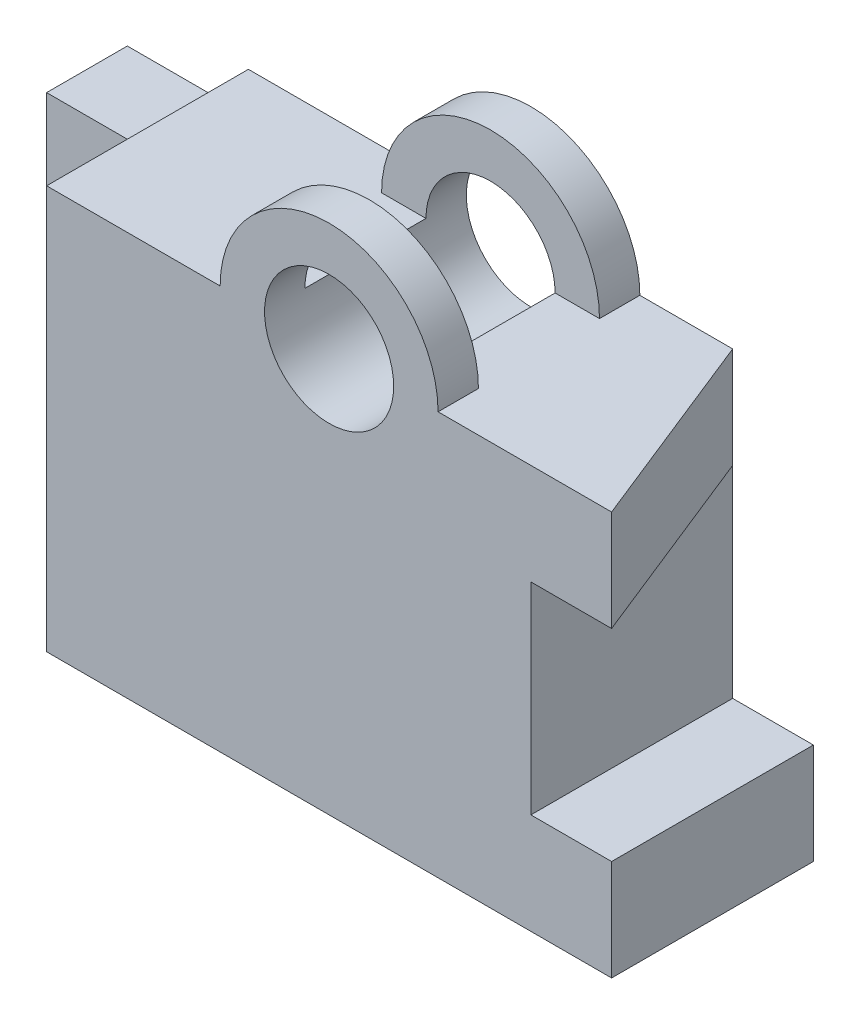
ISO-10303-21;
HEADER;
FILE_DESCRIPTION(('STEP AP214'),'2;1');
FILE_NAME('part.step','',(''),(''),'','','');
FILE_SCHEMA(('AUTOMOTIVE_DESIGN { 1 0 10303 214 1 1 1 1 }'));
ENDSEC;
DATA;
#1=APPLICATION_CONTEXT('core data for automotive mechanical design processes');
#2=APPLICATION_PROTOCOL_DEFINITION('international standard','automotive_design',2000,#1);
#3=PRODUCT_CONTEXT('',#1,'mechanical');
#4=PRODUCT('Part','Part','',(#3));
#5=PRODUCT_RELATED_PRODUCT_CATEGORY('part','',(#4));
#6=PRODUCT_DEFINITION_FORMATION('','',#4);
#7=PRODUCT_DEFINITION_CONTEXT('part definition',#1,'design');
#8=PRODUCT_DEFINITION('design','',#6,#7);
#9=PRODUCT_DEFINITION_SHAPE('','',#8);
#10=(LENGTH_UNIT() NAMED_UNIT(*) SI_UNIT(.MILLI.,.METRE.));
#11=(NAMED_UNIT(*) PLANE_ANGLE_UNIT() SI_UNIT($,.RADIAN.));
#12=(NAMED_UNIT(*) SI_UNIT($,.STERADIAN.) SOLID_ANGLE_UNIT());
#13=UNCERTAINTY_MEASURE_WITH_UNIT(LENGTH_MEASURE(1.E-05),#10,'distance_accuracy_value','');
#14=(GEOMETRIC_REPRESENTATION_CONTEXT(3) GLOBAL_UNCERTAINTY_ASSIGNED_CONTEXT((#13)) GLOBAL_UNIT_ASSIGNED_CONTEXT((#10,
#11,#12)) REPRESENTATION_CONTEXT('',''));
#15=CARTESIAN_POINT('',(0.,0.,0.));
#16=DIRECTION('',(0.,0.,1.));
#17=DIRECTION('',(1.,0.,0.));
#18=AXIS2_PLACEMENT_3D('',#15,#16,#17);
#19=CARTESIAN_POINT('',(0.,25.,25.));
#20=DIRECTION('',(0.,1.,0.));
#21=DIRECTION('',(0.,0.,1.));
#22=AXIS2_PLACEMENT_3D('',#19,#20,#21);
#23=PLANE('',#22);
#24=DIRECTION('',(0.,0.,-1.));
#25=VECTOR('',#24,1.);
#26=CARTESIAN_POINT('',(-8.,25.,25.));
#27=LINE('',#26,#25);
#28=CARTESIAN_POINT('',(-8.,25.,20.));
#29=VERTEX_POINT('',#28);
#30=CARTESIAN_POINT('',(-8.,25.,5.));
#31=VERTEX_POINT('',#30);
#32=EDGE_CURVE('E224',#29,#31,#27,.T.);
#33=ORIENTED_EDGE('',*,*,#32,.T.);
#34=DIRECTION('',(-1.,0.,0.));
#35=VECTOR('',#34,1.);
#36=CARTESIAN_POINT('',(0.,25.,5.));
#37=LINE('',#36,#35);
#38=CARTESIAN_POINT('',(-13.5,25.,5.));
#39=VERTEX_POINT('',#38);
#40=EDGE_CURVE('E51',#31,#39,#37,.T.);
#41=ORIENTED_EDGE('',*,*,#40,.T.);
#42=DIRECTION('',(0.,0.,-1.));
#43=VECTOR('',#42,1.);
#44=CARTESIAN_POINT('',(-13.5,25.,5.));
#45=LINE('',#44,#43);
#46=CARTESIAN_POINT('',(-13.5,25.,0.));
#47=VERTEX_POINT('',#46);
#48=EDGE_CURVE('E55',#39,#47,#45,.T.);
#49=ORIENTED_EDGE('',*,*,#48,.T.);
#50=DIRECTION('',(1.,0.,0.));
#51=VECTOR('',#50,1.);
#52=CARTESIAN_POINT('',(0.,25.,0.));
#53=LINE('',#52,#51);
#54=CARTESIAN_POINT('',(-35.,25.,0.));
#55=VERTEX_POINT('',#54);
#56=EDGE_CURVE('E255',#55,#47,#53,.T.);
#57=ORIENTED_EDGE('',*,*,#56,.F.);
#58=DIRECTION('',(0.,0.,-1.));
#59=VECTOR('',#58,1.);
#60=CARTESIAN_POINT('',(-35.,25.,25.));
#61=LINE('',#60,#59);
#62=CARTESIAN_POINT('',(-35.,25.,25.));
#63=VERTEX_POINT('',#62);
#64=EDGE_CURVE('E221',#63,#55,#61,.T.);
#65=ORIENTED_EDGE('',*,*,#64,.F.);
#66=DIRECTION('',(1.,0.,0.));
#67=VECTOR('',#66,1.);
#68=CARTESIAN_POINT('',(0.,25.,25.));
#69=LINE('',#68,#67);
#70=CARTESIAN_POINT('',(-13.5,25.,25.));
#71=VERTEX_POINT('',#70);
#72=EDGE_CURVE('E208',#63,#71,#69,.T.);
#73=ORIENTED_EDGE('',*,*,#72,.T.);
#74=DIRECTION('',(0.,0.,1.));
#75=VECTOR('',#74,1.);
#76=CARTESIAN_POINT('',(-13.5,25.,20.));
#77=LINE('',#76,#75);
#78=CARTESIAN_POINT('',(-13.5,25.,20.));
#79=VERTEX_POINT('',#78);
#80=EDGE_CURVE('E297',#79,#71,#77,.T.);
#81=ORIENTED_EDGE('',*,*,#80,.F.);
#82=DIRECTION('',(1.,0.,0.));
#83=VECTOR('',#82,1.);
#84=CARTESIAN_POINT('',(0.,25.,20.));
#85=LINE('',#84,#83);
#86=EDGE_CURVE('E256',#79,#29,#85,.T.);
#87=ORIENTED_EDGE('',*,*,#86,.T.);
#88=EDGE_LOOP('',(#33,#41,#49,#57,#65,#73,#81,#87));
#89=FACE_BOUND('',#88,.T.);
#90=ADVANCED_FACE('F36',(#89),#23,.T.);
#91=DIRECTION('',(0.,0.,-1.));
#92=VECTOR('',#91,1.);
#93=CARTESIAN_POINT('',(13.5,25.,5.));
#94=LINE('',#93,#92);
#95=CARTESIAN_POINT('',(13.5,25.,0.));
#96=VERTEX_POINT('',#95);
#97=CARTESIAN_POINT('',(13.5,25.,5.));
#98=VERTEX_POINT('',#97);
#99=EDGE_CURVE('E44',#96,#98,#94,.F.);
#100=ORIENTED_EDGE('',*,*,#99,.T.);
#101=DIRECTION('',(-1.,0.,0.));
#102=VECTOR('',#101,1.);
#103=CARTESIAN_POINT('',(0.,25.,5.));
#104=LINE('',#103,#102);
#105=CARTESIAN_POINT('',(8.,25.,5.));
#106=VERTEX_POINT('',#105);
#107=EDGE_CURVE('E11',#98,#106,#104,.T.);
#108=ORIENTED_EDGE('',*,*,#107,.T.);
#109=DIRECTION('',(0.,0.,-1.));
#110=VECTOR('',#109,1.);
#111=CARTESIAN_POINT('',(8.,25.,25.));
#112=LINE('',#111,#110);
#113=CARTESIAN_POINT('',(8.,25.,20.));
#114=VERTEX_POINT('',#113);
#115=EDGE_CURVE('E193',#114,#106,#112,.T.);
#116=ORIENTED_EDGE('',*,*,#115,.F.);
#117=DIRECTION('',(1.,0.,0.));
#118=VECTOR('',#117,1.);
#119=CARTESIAN_POINT('',(0.,25.,20.));
#120=LINE('',#119,#118);
#121=CARTESIAN_POINT('',(13.5,25.,20.));
#122=VERTEX_POINT('',#121);
#123=EDGE_CURVE('E226',#114,#122,#120,.T.);
#124=ORIENTED_EDGE('',*,*,#123,.T.);
#125=DIRECTION('',(0.,0.,1.));
#126=VECTOR('',#125,1.);
#127=CARTESIAN_POINT('',(13.5,25.,20.));
#128=LINE('',#127,#126);
#129=CARTESIAN_POINT('',(13.5,25.,25.));
#130=VERTEX_POINT('',#129);
#131=EDGE_CURVE('E293',#130,#122,#128,.F.);
#132=ORIENTED_EDGE('',*,*,#131,.F.);
#133=CARTESIAN_POINT('',(35.,25.,25.));
#134=VERTEX_POINT('',#133);
#135=EDGE_CURVE('E200',#130,#134,#69,.T.);
#136=ORIENTED_EDGE('',*,*,#135,.T.);
#137=DIRECTION('',(0.371390676354104,0.,0.928476690885259));
#138=VECTOR('',#137,1.);
#139=CARTESIAN_POINT('',(30.1724137931035,25.,12.9310344827586));
#140=LINE('',#139,#138);
#141=CARTESIAN_POINT('',(25.,25.,0.));
#142=VERTEX_POINT('',#141);
#143=EDGE_CURVE('E286',#142,#134,#140,.T.);
#144=ORIENTED_EDGE('',*,*,#143,.F.);
#145=EDGE_CURVE('E258',#96,#142,#53,.T.);
#146=ORIENTED_EDGE('',*,*,#145,.F.);
#147=EDGE_LOOP('',(#100,#108,#116,#124,#132,#136,#144,#146));
#148=FACE_BOUND('',#147,.T.);
#149=ADVANCED_FACE('F191',(#148),#23,.T.);
#150=CARTESIAN_POINT('',(-20.,7.,-10.));
#151=DIRECTION('',(-1.,0.,0.));
#152=DIRECTION('',(0.,0.,1.));
#153=AXIS2_PLACEMENT_3D('',#150,#151,#152);
#154=PLANE('',#153);
#155=DIRECTION('',(0.,0.,-1.));
#156=VECTOR('',#155,1.);
#157=CARTESIAN_POINT('',(-20.,4.,0.));
#158=LINE('',#157,#156);
#159=CARTESIAN_POINT('',(-20.,4.,0.));
#160=VERTEX_POINT('',#159);
#161=CARTESIAN_POINT('',(-20.,4.,-10.));
#162=VERTEX_POINT('',#161);
#163=EDGE_CURVE('E362',#160,#162,#158,.T.);
#164=ORIENTED_EDGE('',*,*,#163,.F.);
#165=DIRECTION('',(0.,-1.,0.));
#166=VECTOR('',#165,1.);
#167=CARTESIAN_POINT('',(-20.,7.,0.));
#168=LINE('',#167,#166);
#169=CARTESIAN_POINT('',(-20.,-6.,0.));
#170=VERTEX_POINT('',#169);
#171=EDGE_CURVE('E340',#160,#170,#168,.T.);
#172=ORIENTED_EDGE('',*,*,#171,.T.);
#173=DIRECTION('',(0.,0.,1.));
#174=VECTOR('',#173,1.);
#175=CARTESIAN_POINT('',(-20.,-6.,-10.));
#176=LINE('',#175,#174);
#177=CARTESIAN_POINT('',(-20.,-6.,-10.));
#178=VERTEX_POINT('',#177);
#179=EDGE_CURVE('E269',#178,#170,#176,.T.);
#180=ORIENTED_EDGE('',*,*,#179,.F.);
#181=DIRECTION('',(0.,-1.,0.));
#182=VECTOR('',#181,1.);
#183=CARTESIAN_POINT('',(-20.,7.,-10.));
#184=LINE('',#183,#182);
#185=EDGE_CURVE('E349',#162,#178,#184,.T.);
#186=ORIENTED_EDGE('',*,*,#185,.F.);
#187=EDGE_LOOP('',(#164,#172,#180,#186));
#188=FACE_BOUND('',#187,.T.);
#189=ADVANCED_FACE('F420',(#188),#154,.F.);
#190=CARTESIAN_POINT('',(0.,0.,-10.));
#191=DIRECTION('',(0.,0.,1.));
#192=DIRECTION('',(1.,0.,0.));
#193=AXIS2_PLACEMENT_3D('',#190,#191,#192);
#194=PLANE('',#193);
#195=DIRECTION('',(-1.,0.,0.));
#196=VECTOR('',#195,1.);
#197=CARTESIAN_POINT('',(-20.,4.,-10.));
#198=LINE('',#197,#196);
#199=CARTESIAN_POINT('',(-35.,4.,-10.));
#200=VERTEX_POINT('',#199);
#201=EDGE_CURVE('E358',#162,#200,#198,.T.);
#202=ORIENTED_EDGE('',*,*,#201,.F.);
#203=ORIENTED_EDGE('',*,*,#185,.T.);
#204=DIRECTION('',(-1.,0.,0.));
#205=VECTOR('',#204,1.);
#206=CARTESIAN_POINT('',(-35.,-6.,-10.));
#207=LINE('',#206,#205);
#208=CARTESIAN_POINT('',(-35.,-6.,-10.));
#209=VERTEX_POINT('',#208);
#210=EDGE_CURVE('E346',#178,#209,#207,.T.);
#211=ORIENTED_EDGE('',*,*,#210,.T.);
#212=DIRECTION('',(0.,1.,0.));
#213=VECTOR('',#212,1.);
#214=CARTESIAN_POINT('',(-35.,7.,-10.));
#215=LINE('',#214,#213);
#216=EDGE_CURVE('E339',#209,#200,#215,.T.);
#217=ORIENTED_EDGE('',*,*,#216,.T.);
#218=EDGE_LOOP('',(#202,#203,#211,#217));
#219=FACE_BOUND('',#218,.T.);
#220=ADVANCED_FACE('F422',(#219),#194,.F.);
#221=CARTESIAN_POINT('',(0.,0.,0.));
#222=DIRECTION('',(0.,0.,1.));
#223=DIRECTION('',(1.,0.,0.));
#224=AXIS2_PLACEMENT_3D('',#221,#222,#223);
#225=PLANE('',#224);
#226=CARTESIAN_POINT('',(0.,25.,0.));
#227=DIRECTION('',(0.,0.,1.));
#228=DIRECTION('',(1.,0.,0.));
#229=AXIS2_PLACEMENT_3D('',#226,#227,#228);
#230=CIRCLE('',#229,13.5);
#231=EDGE_CURVE('E186',#96,#47,#230,.T.);
#232=ORIENTED_EDGE('',*,*,#231,.F.);
#233=ORIENTED_EDGE('',*,*,#145,.T.);
#234=DIRECTION('',(0.,-1.,0.));
#235=VECTOR('',#234,1.);
#236=CARTESIAN_POINT('',(25.,0.,0.));
#237=LINE('',#236,#235);
#238=CARTESIAN_POINT('',(25.,12.5,0.));
#239=VERTEX_POINT('',#238);
#240=EDGE_CURVE('E228',#142,#239,#237,.T.);
#241=ORIENTED_EDGE('',*,*,#240,.T.);
#242=DIRECTION('',(0.,1.,0.));
#243=VECTOR('',#242,1.);
#244=CARTESIAN_POINT('',(25.,0.,0.));
#245=LINE('',#244,#243);
#246=CARTESIAN_POINT('',(25.,-12.5,0.));
#247=VERTEX_POINT('',#246);
#248=EDGE_CURVE('E210',#247,#239,#245,.T.);
#249=ORIENTED_EDGE('',*,*,#248,.F.);
#250=DIRECTION('',(1.,0.,0.));
#251=VECTOR('',#250,1.);
#252=CARTESIAN_POINT('',(0.,-12.5,0.));
#253=LINE('',#252,#251);
#254=CARTESIAN_POINT('',(35.,-12.5,0.));
#255=VERTEX_POINT('',#254);
#256=EDGE_CURVE('E308',#247,#255,#253,.T.);
#257=ORIENTED_EDGE('',*,*,#256,.T.);
#258=DIRECTION('',(0.,1.,0.));
#259=VECTOR('',#258,1.);
#260=CARTESIAN_POINT('',(35.,0.,0.));
#261=LINE('',#260,#259);
#262=CARTESIAN_POINT('',(35.,-25.,0.));
#263=VERTEX_POINT('',#262);
#264=EDGE_CURVE('E313',#263,#255,#261,.T.);
#265=ORIENTED_EDGE('',*,*,#264,.F.);
#266=DIRECTION('',(1.,0.,0.));
#267=VECTOR('',#266,1.);
#268=CARTESIAN_POINT('',(0.,-25.,0.));
#269=LINE('',#268,#267);
#270=CARTESIAN_POINT('',(-35.,-25.,0.));
#271=VERTEX_POINT('',#270);
#272=EDGE_CURVE('E261',#271,#263,#269,.T.);
#273=ORIENTED_EDGE('',*,*,#272,.F.);
#274=DIRECTION('',(0.,1.,0.));
#275=VECTOR('',#274,1.);
#276=CARTESIAN_POINT('',(-35.,0.,0.));
#277=LINE('',#276,#275);
#278=CARTESIAN_POINT('',(-35.,-6.,0.));
#279=VERTEX_POINT('',#278);
#280=EDGE_CURVE('E235',#271,#279,#277,.T.);
#281=ORIENTED_EDGE('',*,*,#280,.T.);
#282=DIRECTION('',(-1.,0.,0.));
#283=VECTOR('',#282,1.);
#284=CARTESIAN_POINT('',(-35.,-6.,0.));
#285=LINE('',#284,#283);
#286=EDGE_CURVE('E328',#170,#279,#285,.T.);
#287=ORIENTED_EDGE('',*,*,#286,.F.);
#288=ORIENTED_EDGE('',*,*,#171,.F.);
#289=DIRECTION('',(1.,0.,0.));
#290=VECTOR('',#289,1.);
#291=CARTESIAN_POINT('',(-35.,4.,0.));
#292=LINE('',#291,#290);
#293=CARTESIAN_POINT('',(-35.,4.,0.));
#294=VERTEX_POINT('',#293);
#295=EDGE_CURVE('E367',#294,#160,#292,.T.);
#296=ORIENTED_EDGE('',*,*,#295,.F.);
#297=DIRECTION('',(0.,1.,0.));
#298=VECTOR('',#297,1.);
#299=CARTESIAN_POINT('',(-35.,4.,0.));
#300=LINE('',#299,#298);
#301=CARTESIAN_POINT('',(-35.,7.,0.));
#302=VERTEX_POINT('',#301);
#303=EDGE_CURVE('E356',#294,#302,#300,.T.);
#304=ORIENTED_EDGE('',*,*,#303,.T.);
#305=DIRECTION('',(-1.,0.,0.));
#306=VECTOR('',#305,1.);
#307=CARTESIAN_POINT('',(-35.,7.,0.));
#308=LINE('',#307,#306);
#309=CARTESIAN_POINT('',(-50.,7.,0.));
#310=VERTEX_POINT('',#309);
#311=EDGE_CURVE('E265',#302,#310,#308,.T.);
#312=ORIENTED_EDGE('',*,*,#311,.T.);
#313=DIRECTION('',(0.,1.,0.));
#314=VECTOR('',#313,1.);
#315=CARTESIAN_POINT('',(-50.,20.,0.));
#316=LINE('',#315,#314);
#317=CARTESIAN_POINT('',(-50.,20.,0.));
#318=VERTEX_POINT('',#317);
#319=EDGE_CURVE('E268',#310,#318,#316,.T.);
#320=ORIENTED_EDGE('',*,*,#319,.T.);
#321=DIRECTION('',(1.,0.,0.));
#322=VECTOR('',#321,1.);
#323=CARTESIAN_POINT('',(-35.,20.,0.));
#324=LINE('',#323,#322);
#325=CARTESIAN_POINT('',(-35.,20.,0.));
#326=VERTEX_POINT('',#325);
#327=EDGE_CURVE('E378',#318,#326,#324,.T.);
#328=ORIENTED_EDGE('',*,*,#327,.T.);
#329=EDGE_CURVE('E257',#326,#55,#277,.T.);
#330=ORIENTED_EDGE('',*,*,#329,.T.);
#331=ORIENTED_EDGE('',*,*,#56,.T.);
#332=EDGE_LOOP('',(#232,#233,#241,#249,#257,#265,#273,#281,#287,#288,#296,#304,#312,#320,#328,
#330,#331));
#333=FACE_BOUND('',#332,.T.);
#334=CARTESIAN_POINT('',(0.,25.,0.));
#335=DIRECTION('',(0.,0.,1.));
#336=DIRECTION('',(1.,0.,0.));
#337=AXIS2_PLACEMENT_3D('',#334,#335,#336);
#338=CIRCLE('',#337,8.);
#339=CARTESIAN_POINT('',(8.,25.,0.));
#340=VERTEX_POINT('',#339);
#341=EDGE_CURVE('E252',#340,#340,#338,.T.);
#342=ORIENTED_EDGE('',*,*,#341,.T.);
#343=EDGE_LOOP('',(#342));
#344=FACE_BOUND('',#343,.T.);
#345=ADVANCED_FACE('F325',(#333,#344),#225,.F.);
#346=CARTESIAN_POINT('',(-35.,0.,25.));
#347=DIRECTION('',(-1.,0.,0.));
#348=DIRECTION('',(0.,0.,1.));
#349=AXIS2_PLACEMENT_3D('',#346,#347,#348);
#350=PLANE('',#349);
#351=ORIENTED_EDGE('',*,*,#303,.F.);
#352=DIRECTION('',(0.,0.,1.));
#353=VECTOR('',#352,1.);
#354=CARTESIAN_POINT('',(-35.,4.,-10.));
#355=LINE('',#354,#353);
#356=EDGE_CURVE('E415',#200,#294,#355,.T.);
#357=ORIENTED_EDGE('',*,*,#356,.F.);
#358=ORIENTED_EDGE('',*,*,#216,.F.);
#359=DIRECTION('',(0.,0.,1.));
#360=VECTOR('',#359,1.);
#361=CARTESIAN_POINT('',(-35.,-6.,-10.));
#362=LINE('',#361,#360);
#363=EDGE_CURVE('E336',#209,#279,#362,.T.);
#364=ORIENTED_EDGE('',*,*,#363,.T.);
#365=ORIENTED_EDGE('',*,*,#280,.F.);
#366=DIRECTION('',(0.,0.,-1.));
#367=VECTOR('',#366,1.);
#368=CARTESIAN_POINT('',(-35.,-25.,25.));
#369=LINE('',#368,#367);
#370=CARTESIAN_POINT('',(-35.,-25.,25.));
#371=VERTEX_POINT('',#370);
#372=EDGE_CURVE('E219',#371,#271,#369,.T.);
#373=ORIENTED_EDGE('',*,*,#372,.F.);
#374=DIRECTION('',(0.,1.,0.));
#375=VECTOR('',#374,1.);
#376=CARTESIAN_POINT('',(-35.,0.,25.));
#377=LINE('',#376,#375);
#378=EDGE_CURVE('E231',#371,#63,#377,.T.);
#379=ORIENTED_EDGE('',*,*,#378,.T.);
#380=ORIENTED_EDGE('',*,*,#64,.T.);
#381=ORIENTED_EDGE('',*,*,#329,.F.);
#382=DIRECTION('',(0.,0.,-1.));
#383=VECTOR('',#382,1.);
#384=CARTESIAN_POINT('',(-35.,20.,10.));
#385=LINE('',#384,#383);
#386=CARTESIAN_POINT('',(-35.,20.,10.));
#387=VERTEX_POINT('',#386);
#388=EDGE_CURVE('E278',#387,#326,#385,.T.);
#389=ORIENTED_EDGE('',*,*,#388,.F.);
#390=DIRECTION('',(0.,-1.,0.));
#391=VECTOR('',#390,1.);
#392=CARTESIAN_POINT('',(-35.,20.,10.));
#393=LINE('',#392,#391);
#394=CARTESIAN_POINT('',(-35.,7.,10.));
#395=VERTEX_POINT('',#394);
#396=EDGE_CURVE('E374',#387,#395,#393,.T.);
#397=ORIENTED_EDGE('',*,*,#396,.T.);
#398=DIRECTION('',(0.,0.,-1.));
#399=VECTOR('',#398,1.);
#400=CARTESIAN_POINT('',(-35.,7.,10.));
#401=LINE('',#400,#399);
#402=EDGE_CURVE('E272',#395,#302,#401,.T.);
#403=ORIENTED_EDGE('',*,*,#402,.T.);
#404=EDGE_LOOP('',(#351,#357,#358,#364,#365,#373,#379,#380,#381,#389,#397,#403));
#405=FACE_BOUND('',#404,.T.);
#406=ADVANCED_FACE('F343',(#405),#350,.T.);
#407=CARTESIAN_POINT('',(0.,25.,25.));
#408=DIRECTION('',(0.,0.,-1.));
#409=DIRECTION('',(-1.,0.,0.));
#410=AXIS2_PLACEMENT_3D('',#407,#408,#409);
#411=CYLINDRICAL_SURFACE('',#410,8.);
#412=ORIENTED_EDGE('',*,*,#341,.F.);
#413=EDGE_LOOP('',(#412));
#414=FACE_BOUND('',#413,.T.);
#415=CARTESIAN_POINT('',(0.,25.,5.));
#416=DIRECTION('',(0.,0.,1.));
#417=DIRECTION('',(1.,0.,0.));
#418=AXIS2_PLACEMENT_3D('',#415,#416,#417);
#419=CIRCLE('',#418,8.);
#420=EDGE_CURVE('E180',#106,#31,#419,.T.);
#421=ORIENTED_EDGE('',*,*,#420,.T.);
#422=ORIENTED_EDGE('',*,*,#32,.F.);
#423=CARTESIAN_POINT('',(0.,25.,20.));
#424=DIRECTION('',(0.,0.,1.));
#425=DIRECTION('',(1.,0.,0.));
#426=AXIS2_PLACEMENT_3D('',#423,#424,#425);
#427=CIRCLE('',#426,8.);
#428=EDGE_CURVE('E197',#114,#29,#427,.T.);
#429=ORIENTED_EDGE('',*,*,#428,.F.);
#430=ORIENTED_EDGE('',*,*,#115,.T.);
#431=EDGE_LOOP('',(#421,#422,#429,#430));
#432=FACE_BOUND('',#431,.T.);
#433=CARTESIAN_POINT('',(0.,25.,25.));
#434=DIRECTION('',(0.,0.,1.));
#435=DIRECTION('',(1.,0.,0.));
#436=AXIS2_PLACEMENT_3D('',#433,#434,#435);
#437=CIRCLE('',#436,8.);
#438=CARTESIAN_POINT('',(8.,25.,25.));
#439=VERTEX_POINT('',#438);
#440=EDGE_CURVE('E301',#439,#439,#437,.T.);
#441=ORIENTED_EDGE('',*,*,#440,.T.);
#442=EDGE_LOOP('',(#441));
#443=FACE_BOUND('',#442,.T.);
#444=ADVANCED_FACE('F38',(#414,#432,#443),#411,.F.);
#445=CARTESIAN_POINT('',(0.,-25.,25.));
#446=DIRECTION('',(0.,1.,0.));
#447=DIRECTION('',(0.,0.,1.));
#448=AXIS2_PLACEMENT_3D('',#445,#446,#447);
#449=PLANE('',#448);
#450=ORIENTED_EDGE('',*,*,#272,.T.);
#451=DIRECTION('',(0.,0.,-1.));
#452=VECTOR('',#451,1.);
#453=CARTESIAN_POINT('',(35.,-25.,25.));
#454=LINE('',#453,#452);
#455=CARTESIAN_POINT('',(35.,-25.,25.));
#456=VERTEX_POINT('',#455);
#457=EDGE_CURVE('E216',#456,#263,#454,.T.);
#458=ORIENTED_EDGE('',*,*,#457,.F.);
#459=DIRECTION('',(1.,0.,0.));
#460=VECTOR('',#459,1.);
#461=CARTESIAN_POINT('',(0.,-25.,25.));
#462=LINE('',#461,#460);
#463=EDGE_CURVE('E234',#371,#456,#462,.T.);
#464=ORIENTED_EDGE('',*,*,#463,.F.);
#465=ORIENTED_EDGE('',*,*,#372,.T.);
#466=EDGE_LOOP('',(#450,#458,#464,#465));
#467=FACE_BOUND('',#466,.T.);
#468=ADVANCED_FACE('F444',(#467),#449,.F.);
#469=CARTESIAN_POINT('',(35.,0.,25.));
#470=DIRECTION('',(-1.,0.,0.));
#471=DIRECTION('',(0.,0.,1.));
#472=AXIS2_PLACEMENT_3D('',#469,#470,#471);
#473=PLANE('',#472);
#474=ORIENTED_EDGE('',*,*,#264,.T.);
#475=DIRECTION('',(0.,0.,-1.));
#476=VECTOR('',#475,1.);
#477=CARTESIAN_POINT('',(35.,-12.5,25.));
#478=LINE('',#477,#476);
#479=CARTESIAN_POINT('',(35.,-12.5,25.));
#480=VERTEX_POINT('',#479);
#481=EDGE_CURVE('E214',#480,#255,#478,.T.);
#482=ORIENTED_EDGE('',*,*,#481,.F.);
#483=DIRECTION('',(0.,1.,0.));
#484=VECTOR('',#483,1.);
#485=CARTESIAN_POINT('',(35.,0.,25.));
#486=LINE('',#485,#484);
#487=EDGE_CURVE('E242',#456,#480,#486,.T.);
#488=ORIENTED_EDGE('',*,*,#487,.F.);
#489=ORIENTED_EDGE('',*,*,#457,.T.);
#490=EDGE_LOOP('',(#474,#482,#488,#489));
#491=FACE_BOUND('',#490,.T.);
#492=ADVANCED_FACE('F440',(#491),#473,.F.);
#493=CARTESIAN_POINT('',(0.,-12.5,25.));
#494=DIRECTION('',(0.,1.,0.));
#495=DIRECTION('',(0.,0.,1.));
#496=AXIS2_PLACEMENT_3D('',#493,#494,#495);
#497=PLANE('',#496);
#498=ORIENTED_EDGE('',*,*,#256,.F.);
#499=DIRECTION('',(0.,0.,-1.));
#500=VECTOR('',#499,1.);
#501=CARTESIAN_POINT('',(25.,-12.5,25.));
#502=LINE('',#501,#500);
#503=CARTESIAN_POINT('',(25.,-12.5,25.));
#504=VERTEX_POINT('',#503);
#505=EDGE_CURVE('E203',#504,#247,#502,.T.);
#506=ORIENTED_EDGE('',*,*,#505,.F.);
#507=DIRECTION('',(1.,0.,0.));
#508=VECTOR('',#507,1.);
#509=CARTESIAN_POINT('',(0.,-12.5,25.));
#510=LINE('',#509,#508);
#511=EDGE_CURVE('E244',#504,#480,#510,.T.);
#512=ORIENTED_EDGE('',*,*,#511,.T.);
#513=ORIENTED_EDGE('',*,*,#481,.T.);
#514=EDGE_LOOP('',(#498,#506,#512,#513));
#515=FACE_BOUND('',#514,.T.);
#516=ADVANCED_FACE('F443',(#515),#497,.T.);
#517=CARTESIAN_POINT('',(25.,0.,25.));
#518=DIRECTION('',(-1.,0.,0.));
#519=DIRECTION('',(0.,0.,1.));
#520=AXIS2_PLACEMENT_3D('',#517,#518,#519);
#521=PLANE('',#520);
#522=ORIENTED_EDGE('',*,*,#248,.T.);
#523=DIRECTION('',(0.,0.,-1.));
#524=VECTOR('',#523,1.);
#525=CARTESIAN_POINT('',(25.,12.5,25.));
#526=LINE('',#525,#524);
#527=CARTESIAN_POINT('',(25.,12.5,25.));
#528=VERTEX_POINT('',#527);
#529=EDGE_CURVE('E199',#528,#239,#526,.T.);
#530=ORIENTED_EDGE('',*,*,#529,.F.);
#531=DIRECTION('',(0.,1.,0.));
#532=VECTOR('',#531,1.);
#533=CARTESIAN_POINT('',(25.,0.,25.));
#534=LINE('',#533,#532);
#535=EDGE_CURVE('E247',#504,#528,#534,.T.);
#536=ORIENTED_EDGE('',*,*,#535,.F.);
#537=ORIENTED_EDGE('',*,*,#505,.T.);
#538=EDGE_LOOP('',(#522,#530,#536,#537));
#539=FACE_BOUND('',#538,.T.);
#540=ADVANCED_FACE('F449',(#539),#521,.F.);
#541=CARTESIAN_POINT('',(0.,12.5,25.));
#542=DIRECTION('',(0.,1.,0.));
#543=DIRECTION('',(0.,0.,1.));
#544=AXIS2_PLACEMENT_3D('',#541,#542,#543);
#545=PLANE('',#544);
#546=ORIENTED_EDGE('',*,*,#529,.T.);
#547=DIRECTION('',(-0.371390676354104,0.,-0.928476690885259));
#548=VECTOR('',#547,1.);
#549=CARTESIAN_POINT('',(35.,12.5,25.));
#550=LINE('',#549,#548);
#551=CARTESIAN_POINT('',(35.,12.5,25.));
#552=VERTEX_POINT('',#551);
#553=EDGE_CURVE('E284',#552,#239,#550,.T.);
#554=ORIENTED_EDGE('',*,*,#553,.F.);
#555=DIRECTION('',(1.,0.,0.));
#556=VECTOR('',#555,1.);
#557=CARTESIAN_POINT('',(0.,12.5,25.));
#558=LINE('',#557,#556);
#559=EDGE_CURVE('E249',#528,#552,#558,.T.);
#560=ORIENTED_EDGE('',*,*,#559,.F.);
#561=EDGE_LOOP('',(#546,#554,#560));
#562=FACE_BOUND('',#561,.T.);
#563=ADVANCED_FACE('F445',(#562),#545,.F.);
#564=CARTESIAN_POINT('',(0.,0.,25.));
#565=DIRECTION('',(0.,0.,1.));
#566=DIRECTION('',(1.,0.,0.));
#567=AXIS2_PLACEMENT_3D('',#564,#565,#566);
#568=PLANE('',#567);
#569=ORIENTED_EDGE('',*,*,#72,.F.);
#570=ORIENTED_EDGE('',*,*,#378,.F.);
#571=ORIENTED_EDGE('',*,*,#463,.T.);
#572=ORIENTED_EDGE('',*,*,#487,.T.);
#573=ORIENTED_EDGE('',*,*,#511,.F.);
#574=ORIENTED_EDGE('',*,*,#535,.T.);
#575=ORIENTED_EDGE('',*,*,#559,.T.);
#576=EDGE_CURVE('E206',#552,#134,#486,.T.);
#577=ORIENTED_EDGE('',*,*,#576,.T.);
#578=ORIENTED_EDGE('',*,*,#135,.F.);
#579=CARTESIAN_POINT('',(0.,25.,25.));
#580=DIRECTION('',(0.,0.,1.));
#581=DIRECTION('',(1.,0.,0.));
#582=AXIS2_PLACEMENT_3D('',#579,#580,#581);
#583=CIRCLE('',#582,13.5);
#584=EDGE_CURVE('E289',#130,#71,#583,.T.);
#585=ORIENTED_EDGE('',*,*,#584,.T.);
#586=EDGE_LOOP('',(#569,#570,#571,#572,#573,#574,#575,#577,#578,#585));
#587=FACE_BOUND('',#586,.T.);
#588=ORIENTED_EDGE('',*,*,#440,.F.);
#589=EDGE_LOOP('',(#588));
#590=FACE_BOUND('',#589,.T.);
#591=ADVANCED_FACE('F448',(#587,#590),#568,.T.);
#592=CARTESIAN_POINT('',(0.,25.,20.));
#593=DIRECTION('',(0.,0.,1.));
#594=DIRECTION('',(1.,0.,0.));
#595=AXIS2_PLACEMENT_3D('',#592,#593,#594);
#596=CYLINDRICAL_SURFACE('',#595,13.5);
#597=CARTESIAN_POINT('',(0.,25.,20.));
#598=DIRECTION('',(0.,0.,1.));
#599=DIRECTION('',(1.,0.,0.));
#600=AXIS2_PLACEMENT_3D('',#597,#598,#599);
#601=CIRCLE('',#600,13.5);
#602=EDGE_CURVE('E290',#122,#79,#601,.T.);
#603=ORIENTED_EDGE('',*,*,#602,.T.);
#604=ORIENTED_EDGE('',*,*,#80,.T.);
#605=ORIENTED_EDGE('',*,*,#584,.F.);
#606=ORIENTED_EDGE('',*,*,#131,.T.);
#607=EDGE_LOOP('',(#603,#604,#605,#606));
#608=FACE_BOUND('',#607,.T.);
#609=ADVANCED_FACE('F496',(#608),#596,.T.);
#610=CARTESIAN_POINT('',(0.,25.,20.));
#611=DIRECTION('',(0.,0.,1.));
#612=DIRECTION('',(1.,0.,0.));
#613=AXIS2_PLACEMENT_3D('',#610,#611,#612);
#614=PLANE('',#613);
#615=ORIENTED_EDGE('',*,*,#86,.F.);
#616=ORIENTED_EDGE('',*,*,#602,.F.);
#617=ORIENTED_EDGE('',*,*,#123,.F.);
#618=ORIENTED_EDGE('',*,*,#428,.T.);
#619=EDGE_LOOP('',(#615,#616,#617,#618));
#620=FACE_BOUND('',#619,.T.);
#621=ADVANCED_FACE('F503',(#620),#614,.F.);
#622=CARTESIAN_POINT('',(35.,38.5,25.));
#623=DIRECTION('',(-0.928476690885259,0.,0.371390676354104));
#624=DIRECTION('',(0.371390676354104,0.,0.928476690885259));
#625=AXIS2_PLACEMENT_3D('',#622,#623,#624);
#626=PLANE('',#625);
#627=ORIENTED_EDGE('',*,*,#143,.T.);
#628=ORIENTED_EDGE('',*,*,#576,.F.);
#629=ORIENTED_EDGE('',*,*,#553,.T.);
#630=ORIENTED_EDGE('',*,*,#240,.F.);
#631=EDGE_LOOP('',(#627,#628,#629,#630));
#632=FACE_BOUND('',#631,.T.);
#633=ADVANCED_FACE('F510',(#632),#626,.F.);
#634=CARTESIAN_POINT('',(-35.,20.,10.));
#635=DIRECTION('',(0.,1.,0.));
#636=DIRECTION('',(-1.,0.,0.));
#637=AXIS2_PLACEMENT_3D('',#634,#635,#636);
#638=PLANE('',#637);
#639=ORIENTED_EDGE('',*,*,#327,.F.);
#640=DIRECTION('',(0.,0.,-1.));
#641=VECTOR('',#640,1.);
#642=CARTESIAN_POINT('',(-50.,20.,10.));
#643=LINE('',#642,#641);
#644=CARTESIAN_POINT('',(-50.,20.,10.));
#645=VERTEX_POINT('',#644);
#646=EDGE_CURVE('E387',#645,#318,#643,.T.);
#647=ORIENTED_EDGE('',*,*,#646,.F.);
#648=DIRECTION('',(1.,0.,0.));
#649=VECTOR('',#648,1.);
#650=CARTESIAN_POINT('',(-35.,20.,10.));
#651=LINE('',#650,#649);
#652=EDGE_CURVE('E277',#645,#387,#651,.T.);
#653=ORIENTED_EDGE('',*,*,#652,.T.);
#654=ORIENTED_EDGE('',*,*,#388,.T.);
#655=EDGE_LOOP('',(#639,#647,#653,#654));
#656=FACE_BOUND('',#655,.T.);
#657=ADVANCED_FACE('F399',(#656),#638,.T.);
#658=CARTESIAN_POINT('',(-50.,20.,10.));
#659=DIRECTION('',(-1.,0.,0.));
#660=DIRECTION('',(0.,0.,1.));
#661=AXIS2_PLACEMENT_3D('',#658,#659,#660);
#662=PLANE('',#661);
#663=ORIENTED_EDGE('',*,*,#319,.F.);
#664=DIRECTION('',(0.,0.,-1.));
#665=VECTOR('',#664,1.);
#666=CARTESIAN_POINT('',(-50.,7.,10.));
#667=LINE('',#666,#665);
#668=CARTESIAN_POINT('',(-50.,7.,10.));
#669=VERTEX_POINT('',#668);
#670=EDGE_CURVE('E276',#669,#310,#667,.T.);
#671=ORIENTED_EDGE('',*,*,#670,.F.);
#672=DIRECTION('',(0.,1.,0.));
#673=VECTOR('',#672,1.);
#674=CARTESIAN_POINT('',(-50.,20.,10.));
#675=LINE('',#674,#673);
#676=EDGE_CURVE('E381',#669,#645,#675,.T.);
#677=ORIENTED_EDGE('',*,*,#676,.T.);
#678=ORIENTED_EDGE('',*,*,#646,.T.);
#679=EDGE_LOOP('',(#663,#671,#677,#678));
#680=FACE_BOUND('',#679,.T.);
#681=ADVANCED_FACE('F394',(#680),#662,.T.);
#682=CARTESIAN_POINT('',(-35.,7.,10.));
#683=DIRECTION('',(0.,-1.,0.));
#684=DIRECTION('',(1.,0.,0.));
#685=AXIS2_PLACEMENT_3D('',#682,#683,#684);
#686=PLANE('',#685);
#687=ORIENTED_EDGE('',*,*,#311,.F.);
#688=ORIENTED_EDGE('',*,*,#402,.F.);
#689=DIRECTION('',(-1.,0.,0.));
#690=VECTOR('',#689,1.);
#691=CARTESIAN_POINT('',(-35.,7.,10.));
#692=LINE('',#691,#690);
#693=EDGE_CURVE('E377',#395,#669,#692,.T.);
#694=ORIENTED_EDGE('',*,*,#693,.T.);
#695=ORIENTED_EDGE('',*,*,#670,.T.);
#696=EDGE_LOOP('',(#687,#688,#694,#695));
#697=FACE_BOUND('',#696,.T.);
#698=ADVANCED_FACE('F391',(#697),#686,.T.);
#699=CARTESIAN_POINT('',(0.,0.,10.));
#700=DIRECTION('',(0.,0.,-1.));
#701=DIRECTION('',(-1.,0.,0.));
#702=AXIS2_PLACEMENT_3D('',#699,#700,#701);
#703=PLANE('',#702);
#704=ORIENTED_EDGE('',*,*,#396,.F.);
#705=ORIENTED_EDGE('',*,*,#652,.F.);
#706=ORIENTED_EDGE('',*,*,#676,.F.);
#707=ORIENTED_EDGE('',*,*,#693,.F.);
#708=EDGE_LOOP('',(#704,#705,#706,#707));
#709=FACE_BOUND('',#708,.T.);
#710=ADVANCED_FACE('F537',(#709),#703,.F.);
#711=CARTESIAN_POINT('',(-35.,-6.,-10.));
#712=DIRECTION('',(0.,1.,0.));
#713=DIRECTION('',(-1.,0.,0.));
#714=AXIS2_PLACEMENT_3D('',#711,#712,#713);
#715=PLANE('',#714);
#716=ORIENTED_EDGE('',*,*,#286,.T.);
#717=ORIENTED_EDGE('',*,*,#363,.F.);
#718=ORIENTED_EDGE('',*,*,#210,.F.);
#719=ORIENTED_EDGE('',*,*,#179,.T.);
#720=EDGE_LOOP('',(#716,#717,#718,#719));
#721=FACE_BOUND('',#720,.T.);
#722=ADVANCED_FACE('F334',(#721),#715,.F.);
#723=CARTESIAN_POINT('',(0.,3.99999999999999,0.));
#724=DIRECTION('',(0.,1.,0.));
#725=DIRECTION('',(-1.,0.,0.));
#726=AXIS2_PLACEMENT_3D('',#723,#724,#725);
#727=PLANE('',#726);
#728=ORIENTED_EDGE('',*,*,#356,.T.);
#729=ORIENTED_EDGE('',*,*,#295,.T.);
#730=ORIENTED_EDGE('',*,*,#163,.T.);
#731=ORIENTED_EDGE('',*,*,#201,.T.);
#732=EDGE_LOOP('',(#728,#729,#730,#731));
#733=FACE_BOUND('',#732,.T.);
#734=ADVANCED_FACE('F417',(#733),#727,.T.);
#735=CARTESIAN_POINT('',(0.,25.,5.));
#736=DIRECTION('',(0.,0.,-1.));
#737=DIRECTION('',(1.,0.,0.));
#738=AXIS2_PLACEMENT_3D('',#735,#736,#737);
#739=PLANE('',#738);
#740=ORIENTED_EDGE('',*,*,#40,.F.);
#741=ORIENTED_EDGE('',*,*,#420,.F.);
#742=ORIENTED_EDGE('',*,*,#107,.F.);
#743=CARTESIAN_POINT('',(0.,25.,5.));
#744=DIRECTION('',(0.,0.,1.));
#745=DIRECTION('',(1.,0.,0.));
#746=AXIS2_PLACEMENT_3D('',#743,#744,#745);
#747=CIRCLE('',#746,13.5);
#748=EDGE_CURVE('E409',#98,#39,#747,.T.);
#749=ORIENTED_EDGE('',*,*,#748,.T.);
#750=EDGE_LOOP('',(#740,#741,#742,#749));
#751=FACE_BOUND('',#750,.T.);
#752=ADVANCED_FACE('F181',(#751),#739,.F.);
#753=CARTESIAN_POINT('',(0.,25.,5.));
#754=DIRECTION('',(0.,0.,-1.));
#755=DIRECTION('',(-1.,0.,0.));
#756=AXIS2_PLACEMENT_3D('',#753,#754,#755);
#757=CYLINDRICAL_SURFACE('',#756,13.5);
#758=ORIENTED_EDGE('',*,*,#48,.F.);
#759=ORIENTED_EDGE('',*,*,#748,.F.);
#760=ORIENTED_EDGE('',*,*,#99,.F.);
#761=ORIENTED_EDGE('',*,*,#231,.T.);
#762=EDGE_LOOP('',(#758,#759,#760,#761));
#763=FACE_BOUND('',#762,.T.);
#764=ADVANCED_FACE('F408',(#763),#757,.T.);
#765=CLOSED_SHELL('',(#90,#149,#189,#220,#345,#406,#444,#468,#492,#516,#540,#563,#591,#609,#621,
#633,#657,#681,#698,#710,#722,#734,#752,#764));
#766=MANIFOLD_SOLID_BREP('B2',#765);
#767=ADVANCED_BREP_SHAPE_REPRESENTATION('',(#18,#766),#14);
#768=SHAPE_DEFINITION_REPRESENTATION(#9,#767);
ENDSEC;
END-ISO-10303-21;
